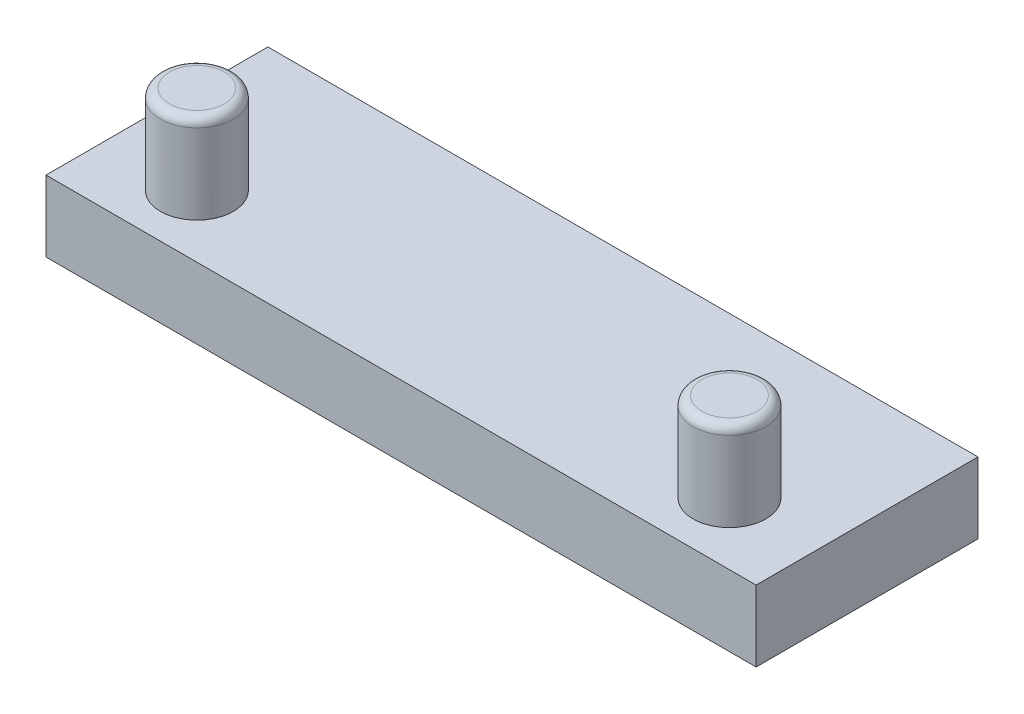
ISO-10303-21;
HEADER;
FILE_DESCRIPTION(('STEP AP214'),'2;1');
FILE_NAME('part.step','',(''),(''),'','','');
FILE_SCHEMA(('AUTOMOTIVE_DESIGN { 1 0 10303 214 1 1 1 1 }'));
ENDSEC;
DATA;
#1=APPLICATION_CONTEXT('core data for automotive mechanical design processes');
#2=APPLICATION_PROTOCOL_DEFINITION('international standard','automotive_design',2000,#1);
#3=PRODUCT_CONTEXT('',#1,'mechanical');
#4=PRODUCT('Part','Part','',(#3));
#5=PRODUCT_RELATED_PRODUCT_CATEGORY('part','',(#4));
#6=PRODUCT_DEFINITION_FORMATION('','',#4);
#7=PRODUCT_DEFINITION_CONTEXT('part definition',#1,'design');
#8=PRODUCT_DEFINITION('design','',#6,#7);
#9=PRODUCT_DEFINITION_SHAPE('','',#8);
#10=(LENGTH_UNIT() NAMED_UNIT(*) SI_UNIT(.MILLI.,.METRE.));
#11=(NAMED_UNIT(*) PLANE_ANGLE_UNIT() SI_UNIT($,.RADIAN.));
#12=(NAMED_UNIT(*) SI_UNIT($,.STERADIAN.) SOLID_ANGLE_UNIT());
#13=UNCERTAINTY_MEASURE_WITH_UNIT(LENGTH_MEASURE(1.E-05),#10,'distance_accuracy_value','');
#14=(GEOMETRIC_REPRESENTATION_CONTEXT(3) GLOBAL_UNCERTAINTY_ASSIGNED_CONTEXT((#13)) GLOBAL_UNIT_ASSIGNED_CONTEXT((#10,
#11,#12)) REPRESENTATION_CONTEXT('',''));
#15=CARTESIAN_POINT('',(0.,0.,0.));
#16=DIRECTION('',(0.,0.,1.));
#17=DIRECTION('',(1.,0.,0.));
#18=AXIS2_PLACEMENT_3D('',#15,#16,#17);
#19=CARTESIAN_POINT('',(0.,0.,5.));
#20=DIRECTION('',(0.,0.,1.));
#21=DIRECTION('',(1.,0.,0.));
#22=AXIS2_PLACEMENT_3D('',#19,#20,#21);
#23=PLANE('',#22);
#24=CARTESIAN_POINT('',(-5.,3.,5.));
#25=DIRECTION('',(0.,0.,1.));
#26=DIRECTION('',(1.,0.,0.));
#27=AXIS2_PLACEMENT_3D('',#24,#25,#26);
#28=CIRCLE('',#27,1.5);
#29=CARTESIAN_POINT('',(-3.5,3.,5.));
#30=VERTEX_POINT('',#29);
#31=EDGE_CURVE('E177',#30,#30,#28,.T.);
#32=ORIENTED_EDGE('',*,*,#31,.F.);
#33=EDGE_LOOP('',(#32));
#34=FACE_BOUND('',#33,.T.);
#35=CARTESIAN_POINT('',(5.,3.,5.));
#36=DIRECTION('',(0.,0.,1.));
#37=DIRECTION('',(1.,0.,0.));
#38=AXIS2_PLACEMENT_3D('',#35,#36,#37);
#39=CIRCLE('',#38,1.5);
#40=CARTESIAN_POINT('',(6.5,3.,5.));
#41=VERTEX_POINT('',#40);
#42=EDGE_CURVE('E169',#41,#41,#39,.T.);
#43=ORIENTED_EDGE('',*,*,#42,.F.);
#44=EDGE_LOOP('',(#43));
#45=FACE_BOUND('',#44,.T.);
#46=DIRECTION('',(0.,1.,0.));
#47=VECTOR('',#46,1.);
#48=CARTESIAN_POINT('',(10.,0.,5.));
#49=LINE('',#48,#47);
#50=CARTESIAN_POINT('',(10.,0.,5.));
#51=VERTEX_POINT('',#50);
#52=CARTESIAN_POINT('',(10.,6.,5.));
#53=VERTEX_POINT('',#52);
#54=EDGE_CURVE('E190',#51,#53,#49,.T.);
#55=ORIENTED_EDGE('',*,*,#54,.T.);
#56=DIRECTION('',(-1.,0.,0.));
#57=VECTOR('',#56,1.);
#58=CARTESIAN_POINT('',(0.,6.,5.));
#59=LINE('',#58,#57);
#60=CARTESIAN_POINT('',(-10.,6.,5.));
#61=VERTEX_POINT('',#60);
#62=EDGE_CURVE('E157',#53,#61,#59,.T.);
#63=ORIENTED_EDGE('',*,*,#62,.T.);
#64=DIRECTION('',(0.,-1.,0.));
#65=VECTOR('',#64,1.);
#66=CARTESIAN_POINT('',(-10.,10.,5.));
#67=LINE('',#66,#65);
#68=CARTESIAN_POINT('',(-10.,0.,5.));
#69=VERTEX_POINT('',#68);
#70=EDGE_CURVE('E184',#61,#69,#67,.T.);
#71=ORIENTED_EDGE('',*,*,#70,.T.);
#72=DIRECTION('',(1.,0.,0.));
#73=VECTOR('',#72,1.);
#74=CARTESIAN_POINT('',(-10.,0.,5.));
#75=LINE('',#74,#73);
#76=EDGE_CURVE('E56',#69,#51,#75,.T.);
#77=ORIENTED_EDGE('',*,*,#76,.T.);
#78=EDGE_LOOP('',(#55,#63,#71,#77));
#79=FACE_BOUND('',#78,.T.);
#80=ADVANCED_FACE('F38',(#34,#45,#79),#23,.T.);
#81=CARTESIAN_POINT('',(-10.,10.,5.));
#82=DIRECTION('',(1.,0.,0.));
#83=DIRECTION('',(0.,1.,0.));
#84=AXIS2_PLACEMENT_3D('',#81,#82,#83);
#85=PLANE('',#84);
#86=DIRECTION('',(0.,0.,1.));
#87=VECTOR('',#86,1.);
#88=CARTESIAN_POINT('',(-10.,6.,5.));
#89=LINE('',#88,#87);
#90=CARTESIAN_POINT('',(-10.,6.,0.));
#91=VERTEX_POINT('',#90);
#92=EDGE_CURVE('E75',#91,#61,#89,.T.);
#93=ORIENTED_EDGE('',*,*,#92,.F.);
#94=DIRECTION('',(0.,-1.,0.));
#95=VECTOR('',#94,1.);
#96=CARTESIAN_POINT('',(-10.,10.,0.));
#97=LINE('',#96,#95);
#98=CARTESIAN_POINT('',(-10.,0.,0.));
#99=VERTEX_POINT('',#98);
#100=EDGE_CURVE('E67',#91,#99,#97,.T.);
#101=ORIENTED_EDGE('',*,*,#100,.T.);
#102=DIRECTION('',(0.,0.,-1.));
#103=VECTOR('',#102,1.);
#104=CARTESIAN_POINT('',(-10.,0.,5.));
#105=LINE('',#104,#103);
#106=EDGE_CURVE('E208',#69,#99,#105,.T.);
#107=ORIENTED_EDGE('',*,*,#106,.F.);
#108=ORIENTED_EDGE('',*,*,#70,.F.);
#109=EDGE_LOOP('',(#93,#101,#107,#108));
#110=FACE_BOUND('',#109,.T.);
#111=ADVANCED_FACE('F246',(#110),#85,.F.);
#112=CARTESIAN_POINT('',(10.,0.,5.));
#113=DIRECTION('',(-1.,0.,0.));
#114=DIRECTION('',(0.,-1.,0.));
#115=AXIS2_PLACEMENT_3D('',#112,#113,#114);
#116=PLANE('',#115);
#117=DIRECTION('',(0.,0.,-1.));
#118=VECTOR('',#117,1.);
#119=CARTESIAN_POINT('',(10.,6.,5.));
#120=LINE('',#119,#118);
#121=CARTESIAN_POINT('',(10.,6.,0.));
#122=VERTEX_POINT('',#121);
#123=EDGE_CURVE('E212',#53,#122,#120,.T.);
#124=ORIENTED_EDGE('',*,*,#123,.F.);
#125=ORIENTED_EDGE('',*,*,#54,.F.);
#126=DIRECTION('',(0.,0.,-1.));
#127=VECTOR('',#126,1.);
#128=CARTESIAN_POINT('',(10.,0.,5.));
#129=LINE('',#128,#127);
#130=CARTESIAN_POINT('',(10.,0.,0.));
#131=VERTEX_POINT('',#130);
#132=EDGE_CURVE('E193',#51,#131,#129,.T.);
#133=ORIENTED_EDGE('',*,*,#132,.T.);
#134=DIRECTION('',(0.,1.,0.));
#135=VECTOR('',#134,1.);
#136=CARTESIAN_POINT('',(10.,0.,0.));
#137=LINE('',#136,#135);
#138=EDGE_CURVE('E199',#131,#122,#137,.T.);
#139=ORIENTED_EDGE('',*,*,#138,.T.);
#140=EDGE_LOOP('',(#124,#125,#133,#139));
#141=FACE_BOUND('',#140,.T.);
#142=ADVANCED_FACE('F252',(#141),#116,.F.);
#143=CARTESIAN_POINT('',(0.,0.,0.));
#144=DIRECTION('',(0.,0.,1.));
#145=DIRECTION('',(1.,0.,0.));
#146=AXIS2_PLACEMENT_3D('',#143,#144,#145);
#147=PLANE('',#146);
#148=DIRECTION('',(-1.,0.,0.));
#149=VECTOR('',#148,1.);
#150=CARTESIAN_POINT('',(10.,10.,0.));
#151=LINE('',#150,#149);
#152=CARTESIAN_POINT('',(20.,10.,0.));
#153=VERTEX_POINT('',#152);
#154=CARTESIAN_POINT('',(-20.,10.,0.));
#155=VERTEX_POINT('',#154);
#156=EDGE_CURVE('E187',#153,#155,#151,.T.);
#157=ORIENTED_EDGE('',*,*,#156,.F.);
#158=DIRECTION('',(0.,1.,0.));
#159=VECTOR('',#158,1.);
#160=CARTESIAN_POINT('',(20.,6.00000000000001,0.));
#161=LINE('',#160,#159);
#162=CARTESIAN_POINT('',(20.,6.00000000000001,0.));
#163=VERTEX_POINT('',#162);
#164=EDGE_CURVE('E158',#163,#153,#161,.T.);
#165=ORIENTED_EDGE('',*,*,#164,.F.);
#166=DIRECTION('',(-1.,0.,0.));
#167=VECTOR('',#166,1.);
#168=CARTESIAN_POINT('',(-20.,6.,0.));
#169=LINE('',#168,#167);
#170=EDGE_CURVE('E122',#163,#122,#169,.T.);
#171=ORIENTED_EDGE('',*,*,#170,.T.);
#172=ORIENTED_EDGE('',*,*,#138,.F.);
#173=DIRECTION('',(1.,0.,0.));
#174=VECTOR('',#173,1.);
#175=CARTESIAN_POINT('',(-10.,0.,0.));
#176=LINE('',#175,#174);
#177=EDGE_CURVE('E196',#99,#131,#176,.T.);
#178=ORIENTED_EDGE('',*,*,#177,.F.);
#179=ORIENTED_EDGE('',*,*,#100,.F.);
#180=CARTESIAN_POINT('',(-20.,6.,0.));
#181=VERTEX_POINT('',#180);
#182=EDGE_CURVE('E146',#91,#181,#169,.T.);
#183=ORIENTED_EDGE('',*,*,#182,.T.);
#184=DIRECTION('',(0.,1.,0.));
#185=VECTOR('',#184,1.);
#186=CARTESIAN_POINT('',(-20.,6.,0.));
#187=LINE('',#186,#185);
#188=EDGE_CURVE('E136',#181,#155,#187,.T.);
#189=ORIENTED_EDGE('',*,*,#188,.T.);
#190=EDGE_LOOP('',(#157,#165,#171,#172,#178,#179,#183,#189));
#191=FACE_BOUND('',#190,.T.);
#192=CARTESIAN_POINT('',(5.,3.,0.));
#193=DIRECTION('',(0.,0.,1.));
#194=DIRECTION('',(1.,0.,0.));
#195=AXIS2_PLACEMENT_3D('',#192,#193,#194);
#196=CIRCLE('',#195,1.5);
#197=CARTESIAN_POINT('',(6.5,3.,0.));
#198=VERTEX_POINT('',#197);
#199=EDGE_CURVE('E168',#198,#198,#196,.T.);
#200=ORIENTED_EDGE('',*,*,#199,.T.);
#201=EDGE_LOOP('',(#200));
#202=FACE_BOUND('',#201,.T.);
#203=CARTESIAN_POINT('',(-5.,3.,0.));
#204=DIRECTION('',(0.,0.,1.));
#205=DIRECTION('',(1.,0.,0.));
#206=AXIS2_PLACEMENT_3D('',#203,#204,#205);
#207=CIRCLE('',#206,1.5);
#208=CARTESIAN_POINT('',(-3.5,3.,0.));
#209=VERTEX_POINT('',#208);
#210=EDGE_CURVE('E173',#209,#209,#207,.T.);
#211=ORIENTED_EDGE('',*,*,#210,.T.);
#212=EDGE_LOOP('',(#211));
#213=FACE_BOUND('',#212,.T.);
#214=ADVANCED_FACE('F260',(#191,#202,#213),#147,.F.);
#215=CARTESIAN_POINT('',(-10.,0.,5.));
#216=DIRECTION('',(0.,1.,0.));
#217=DIRECTION('',(-1.,0.,0.));
#218=AXIS2_PLACEMENT_3D('',#215,#216,#217);
#219=PLANE('',#218);
#220=ORIENTED_EDGE('',*,*,#177,.T.);
#221=ORIENTED_EDGE('',*,*,#132,.F.);
#222=ORIENTED_EDGE('',*,*,#76,.F.);
#223=ORIENTED_EDGE('',*,*,#106,.T.);
#224=EDGE_LOOP('',(#220,#221,#222,#223));
#225=FACE_BOUND('',#224,.T.);
#226=ADVANCED_FACE('F263',(#225),#219,.F.);
#227=CARTESIAN_POINT('',(10.,10.,5.));
#228=DIRECTION('',(0.,-1.,0.));
#229=DIRECTION('',(1.,0.,0.));
#230=AXIS2_PLACEMENT_3D('',#227,#228,#229);
#231=PLANE('',#230);
#232=CARTESIAN_POINT('',(15.,10.,9.));
#233=DIRECTION('',(0.,-1.,0.));
#234=DIRECTION('',(1.,0.,0.));
#235=AXIS2_PLACEMENT_3D('',#232,#233,#234);
#236=CIRCLE('',#235,2.05);
#237=CARTESIAN_POINT('',(17.05,10.,9.));
#238=VERTEX_POINT('',#237);
#239=EDGE_CURVE('E219',#238,#238,#236,.F.);
#240=ORIENTED_EDGE('',*,*,#239,.F.);
#241=EDGE_LOOP('',(#240));
#242=FACE_BOUND('',#241,.T.);
#243=CARTESIAN_POINT('',(-15.,10.,9.));
#244=DIRECTION('',(0.,-1.,0.));
#245=DIRECTION('',(1.,0.,0.));
#246=AXIS2_PLACEMENT_3D('',#243,#244,#245);
#247=CIRCLE('',#246,2.05);
#248=CARTESIAN_POINT('',(-12.95,10.,9.));
#249=VERTEX_POINT('',#248);
#250=EDGE_CURVE('E215',#249,#249,#247,.F.);
#251=ORIENTED_EDGE('',*,*,#250,.F.);
#252=EDGE_LOOP('',(#251));
#253=FACE_BOUND('',#252,.T.);
#254=ORIENTED_EDGE('',*,*,#156,.T.);
#255=DIRECTION('',(0.,0.,1.));
#256=VECTOR('',#255,1.);
#257=CARTESIAN_POINT('',(-20.,10.,0.));
#258=LINE('',#257,#256);
#259=CARTESIAN_POINT('',(-20.,10.,12.5));
#260=VERTEX_POINT('',#259);
#261=EDGE_CURVE('E150',#155,#260,#258,.T.);
#262=ORIENTED_EDGE('',*,*,#261,.T.);
#263=DIRECTION('',(1.,0.,0.));
#264=VECTOR('',#263,1.);
#265=CARTESIAN_POINT('',(-20.,10.,12.5));
#266=LINE('',#265,#264);
#267=CARTESIAN_POINT('',(20.,10.,12.5));
#268=VERTEX_POINT('',#267);
#269=EDGE_CURVE('E115',#260,#268,#266,.T.);
#270=ORIENTED_EDGE('',*,*,#269,.T.);
#271=DIRECTION('',(0.,0.,-1.));
#272=VECTOR('',#271,1.);
#273=CARTESIAN_POINT('',(20.,10.,0.));
#274=LINE('',#273,#272);
#275=EDGE_CURVE('E138',#268,#153,#274,.T.);
#276=ORIENTED_EDGE('',*,*,#275,.T.);
#277=EDGE_LOOP('',(#254,#262,#270,#276));
#278=FACE_BOUND('',#277,.T.);
#279=ADVANCED_FACE('F265',(#242,#253,#278),#231,.F.);
#280=CARTESIAN_POINT('',(-5.,3.,5.));
#281=DIRECTION('',(0.,0.,-1.));
#282=DIRECTION('',(-1.,0.,0.));
#283=AXIS2_PLACEMENT_3D('',#280,#281,#282);
#284=CYLINDRICAL_SURFACE('',#283,1.5);
#285=ORIENTED_EDGE('',*,*,#31,.T.);
#286=EDGE_LOOP('',(#285));
#287=FACE_BOUND('',#286,.T.);
#288=ORIENTED_EDGE('',*,*,#210,.F.);
#289=EDGE_LOOP('',(#288));
#290=FACE_BOUND('',#289,.T.);
#291=ADVANCED_FACE('F258',(#287,#290),#284,.F.);
#292=CARTESIAN_POINT('',(5.,3.,5.));
#293=DIRECTION('',(0.,0.,-1.));
#294=DIRECTION('',(-1.,0.,0.));
#295=AXIS2_PLACEMENT_3D('',#292,#293,#294);
#296=CYLINDRICAL_SURFACE('',#295,1.5);
#297=ORIENTED_EDGE('',*,*,#42,.T.);
#298=EDGE_LOOP('',(#297));
#299=FACE_BOUND('',#298,.T.);
#300=ORIENTED_EDGE('',*,*,#199,.F.);
#301=EDGE_LOOP('',(#300));
#302=FACE_BOUND('',#301,.T.);
#303=ADVANCED_FACE('F297',(#299,#302),#296,.F.);
#304=CARTESIAN_POINT('',(0.,6.,0.));
#305=DIRECTION('',(0.,1.,0.));
#306=DIRECTION('',(-1.,0.,0.));
#307=AXIS2_PLACEMENT_3D('',#304,#305,#306);
#308=PLANE('',#307);
#309=ORIENTED_EDGE('',*,*,#182,.F.);
#310=ORIENTED_EDGE('',*,*,#92,.T.);
#311=ORIENTED_EDGE('',*,*,#62,.F.);
#312=ORIENTED_EDGE('',*,*,#123,.T.);
#313=ORIENTED_EDGE('',*,*,#170,.F.);
#314=DIRECTION('',(0.,0.,-1.));
#315=VECTOR('',#314,1.);
#316=CARTESIAN_POINT('',(20.,6.00000000000001,0.));
#317=LINE('',#316,#315);
#318=CARTESIAN_POINT('',(20.,6.00000000000001,12.5));
#319=VERTEX_POINT('',#318);
#320=EDGE_CURVE('E130',#319,#163,#317,.T.);
#321=ORIENTED_EDGE('',*,*,#320,.F.);
#322=DIRECTION('',(1.,0.,0.));
#323=VECTOR('',#322,1.);
#324=CARTESIAN_POINT('',(-20.,6.,12.5));
#325=LINE('',#324,#323);
#326=CARTESIAN_POINT('',(-20.,6.,12.5));
#327=VERTEX_POINT('',#326);
#328=EDGE_CURVE('E113',#327,#319,#325,.T.);
#329=ORIENTED_EDGE('',*,*,#328,.F.);
#330=DIRECTION('',(0.,0.,1.));
#331=VECTOR('',#330,1.);
#332=CARTESIAN_POINT('',(-20.,6.,0.));
#333=LINE('',#332,#331);
#334=EDGE_CURVE('E127',#181,#327,#333,.T.);
#335=ORIENTED_EDGE('',*,*,#334,.F.);
#336=EDGE_LOOP('',(#309,#310,#311,#312,#313,#321,#329,#335));
#337=FACE_BOUND('',#336,.T.);
#338=ADVANCED_FACE('F126',(#337),#308,.F.);
#339=CARTESIAN_POINT('',(-20.,6.,0.));
#340=DIRECTION('',(-1.,0.,0.));
#341=DIRECTION('',(0.,0.,1.));
#342=AXIS2_PLACEMENT_3D('',#339,#340,#341);
#343=PLANE('',#342);
#344=ORIENTED_EDGE('',*,*,#261,.F.);
#345=ORIENTED_EDGE('',*,*,#188,.F.);
#346=ORIENTED_EDGE('',*,*,#334,.T.);
#347=DIRECTION('',(0.,1.,0.));
#348=VECTOR('',#347,1.);
#349=CARTESIAN_POINT('',(-20.,6.,12.5));
#350=LINE('',#349,#348);
#351=EDGE_CURVE('E110',#327,#260,#350,.T.);
#352=ORIENTED_EDGE('',*,*,#351,.T.);
#353=EDGE_LOOP('',(#344,#345,#346,#352));
#354=FACE_BOUND('',#353,.T.);
#355=ADVANCED_FACE('F134',(#354),#343,.T.);
#356=CARTESIAN_POINT('',(20.,6.00000000000001,0.));
#357=DIRECTION('',(1.,0.,0.));
#358=DIRECTION('',(0.,0.,-1.));
#359=AXIS2_PLACEMENT_3D('',#356,#357,#358);
#360=PLANE('',#359);
#361=ORIENTED_EDGE('',*,*,#275,.F.);
#362=DIRECTION('',(0.,1.,0.));
#363=VECTOR('',#362,1.);
#364=CARTESIAN_POINT('',(20.,6.00000000000001,12.5));
#365=LINE('',#364,#363);
#366=EDGE_CURVE('E121',#319,#268,#365,.T.);
#367=ORIENTED_EDGE('',*,*,#366,.F.);
#368=ORIENTED_EDGE('',*,*,#320,.T.);
#369=ORIENTED_EDGE('',*,*,#164,.T.);
#370=EDGE_LOOP('',(#361,#367,#368,#369));
#371=FACE_BOUND('',#370,.T.);
#372=ADVANCED_FACE('F285',(#371),#360,.T.);
#373=CARTESIAN_POINT('',(-20.,6.,12.5));
#374=DIRECTION('',(0.,0.,1.));
#375=DIRECTION('',(1.,0.,0.));
#376=AXIS2_PLACEMENT_3D('',#373,#374,#375);
#377=PLANE('',#376);
#378=ORIENTED_EDGE('',*,*,#269,.F.);
#379=ORIENTED_EDGE('',*,*,#351,.F.);
#380=ORIENTED_EDGE('',*,*,#328,.T.);
#381=ORIENTED_EDGE('',*,*,#366,.T.);
#382=EDGE_LOOP('',(#378,#379,#380,#381));
#383=FACE_BOUND('',#382,.T.);
#384=ADVANCED_FACE('F112',(#383),#377,.T.);
#385=CARTESIAN_POINT('',(-15.,15.,9.));
#386=DIRECTION('',(0.,-1.,0.));
#387=DIRECTION('',(1.,0.,0.));
#388=AXIS2_PLACEMENT_3D('',#385,#386,#387);
#389=CYLINDRICAL_SURFACE('',#388,2.05);
#390=CARTESIAN_POINT('',(-15.,14.5,9.));
#391=DIRECTION('',(0.,1.,0.));
#392=DIRECTION('',(-1.,0.,0.));
#393=AXIS2_PLACEMENT_3D('',#390,#391,#392);
#394=CIRCLE('',#393,2.05);
#395=CARTESIAN_POINT('',(-17.05,14.5,9.));
#396=VERTEX_POINT('',#395);
#397=EDGE_CURVE('E11',#396,#396,#394,.F.);
#398=ORIENTED_EDGE('',*,*,#397,.T.);
#399=EDGE_LOOP('',(#398));
#400=FACE_BOUND('',#399,.T.);
#401=ORIENTED_EDGE('',*,*,#250,.T.);
#402=EDGE_LOOP('',(#401));
#403=FACE_BOUND('',#402,.T.);
#404=ADVANCED_FACE('F292',(#400,#403),#389,.T.);
#405=CARTESIAN_POINT('',(-15.,15.,9.));
#406=DIRECTION('',(0.,1.,0.));
#407=DIRECTION('',(-1.,0.,0.));
#408=AXIS2_PLACEMENT_3D('',#405,#406,#407);
#409=PLANE('',#408);
#410=CARTESIAN_POINT('',(-15.,15.,9.));
#411=DIRECTION('',(0.,1.,0.));
#412=DIRECTION('',(-1.,0.,0.));
#413=AXIS2_PLACEMENT_3D('',#410,#411,#412);
#414=CIRCLE('',#413,1.55);
#415=CARTESIAN_POINT('',(-16.55,15.,9.));
#416=VERTEX_POINT('',#415);
#417=EDGE_CURVE('E48',#416,#416,#414,.T.);
#418=ORIENTED_EDGE('',*,*,#417,.T.);
#419=EDGE_LOOP('',(#418));
#420=FACE_BOUND('',#419,.T.);
#421=ADVANCED_FACE('F234',(#420),#409,.T.);
#422=CARTESIAN_POINT('',(15.,15.,9.));
#423=DIRECTION('',(0.,-1.,0.));
#424=DIRECTION('',(1.,0.,0.));
#425=AXIS2_PLACEMENT_3D('',#422,#423,#424);
#426=CYLINDRICAL_SURFACE('',#425,2.05);
#427=CARTESIAN_POINT('',(15.,14.5,9.));
#428=DIRECTION('',(0.,1.,0.));
#429=DIRECTION('',(-1.,0.,0.));
#430=AXIS2_PLACEMENT_3D('',#427,#428,#429);
#431=CIRCLE('',#430,2.05);
#432=CARTESIAN_POINT('',(12.95,14.5,9.));
#433=VERTEX_POINT('',#432);
#434=EDGE_CURVE('E227',#433,#433,#431,.F.);
#435=ORIENTED_EDGE('',*,*,#434,.T.);
#436=EDGE_LOOP('',(#435));
#437=FACE_BOUND('',#436,.T.);
#438=ORIENTED_EDGE('',*,*,#239,.T.);
#439=EDGE_LOOP('',(#438));
#440=FACE_BOUND('',#439,.T.);
#441=ADVANCED_FACE('F340',(#437,#440),#426,.T.);
#442=CARTESIAN_POINT('',(15.,15.,9.));
#443=DIRECTION('',(0.,1.,0.));
#444=DIRECTION('',(-1.,0.,0.));
#445=AXIS2_PLACEMENT_3D('',#442,#443,#444);
#446=PLANE('',#445);
#447=CARTESIAN_POINT('',(15.,15.,9.));
#448=DIRECTION('',(0.,1.,0.));
#449=DIRECTION('',(-1.,0.,0.));
#450=AXIS2_PLACEMENT_3D('',#447,#448,#449);
#451=CIRCLE('',#450,1.55);
#452=CARTESIAN_POINT('',(13.45,15.,9.));
#453=VERTEX_POINT('',#452);
#454=EDGE_CURVE('E223',#453,#453,#451,.T.);
#455=ORIENTED_EDGE('',*,*,#454,.T.);
#456=EDGE_LOOP('',(#455));
#457=FACE_BOUND('',#456,.T.);
#458=ADVANCED_FACE('F242',(#457),#446,.T.);
#459=CARTESIAN_POINT('',(15.,14.5,9.));
#460=DIRECTION('',(0.,1.,0.));
#461=DIRECTION('',(-1.,0.,0.));
#462=AXIS2_PLACEMENT_3D('',#459,#460,#461);
#463=TOROIDAL_SURFACE('',#462,1.55,0.5);
#464=ORIENTED_EDGE('',*,*,#434,.F.);
#465=EDGE_LOOP('',(#464));
#466=FACE_BOUND('',#465,.T.);
#467=ORIENTED_EDGE('',*,*,#454,.F.);
#468=EDGE_LOOP('',(#467));
#469=FACE_BOUND('',#468,.T.);
#470=ADVANCED_FACE('F237',(#466,#469),#463,.T.);
#471=CARTESIAN_POINT('',(-15.,14.5,9.));
#472=DIRECTION('',(0.,1.,0.));
#473=DIRECTION('',(-1.,0.,0.));
#474=AXIS2_PLACEMENT_3D('',#471,#472,#473);
#475=TOROIDAL_SURFACE('',#474,1.55,0.5);
#476=ORIENTED_EDGE('',*,*,#397,.F.);
#477=EDGE_LOOP('',(#476));
#478=FACE_BOUND('',#477,.T.);
#479=ORIENTED_EDGE('',*,*,#417,.F.);
#480=EDGE_LOOP('',(#479));
#481=FACE_BOUND('',#480,.T.);
#482=ADVANCED_FACE('F40',(#478,#481),#475,.T.);
#483=CLOSED_SHELL('',(#80,#111,#142,#214,#226,#279,#291,#303,#338,#355,#372,#384,#404,#421,#441,
#458,#470,#482));
#484=MANIFOLD_SOLID_BREP('B2',#483);
#485=ADVANCED_BREP_SHAPE_REPRESENTATION('',(#18,#484),#14);
#486=SHAPE_DEFINITION_REPRESENTATION(#9,#485);
ENDSEC;
END-ISO-10303-21;
